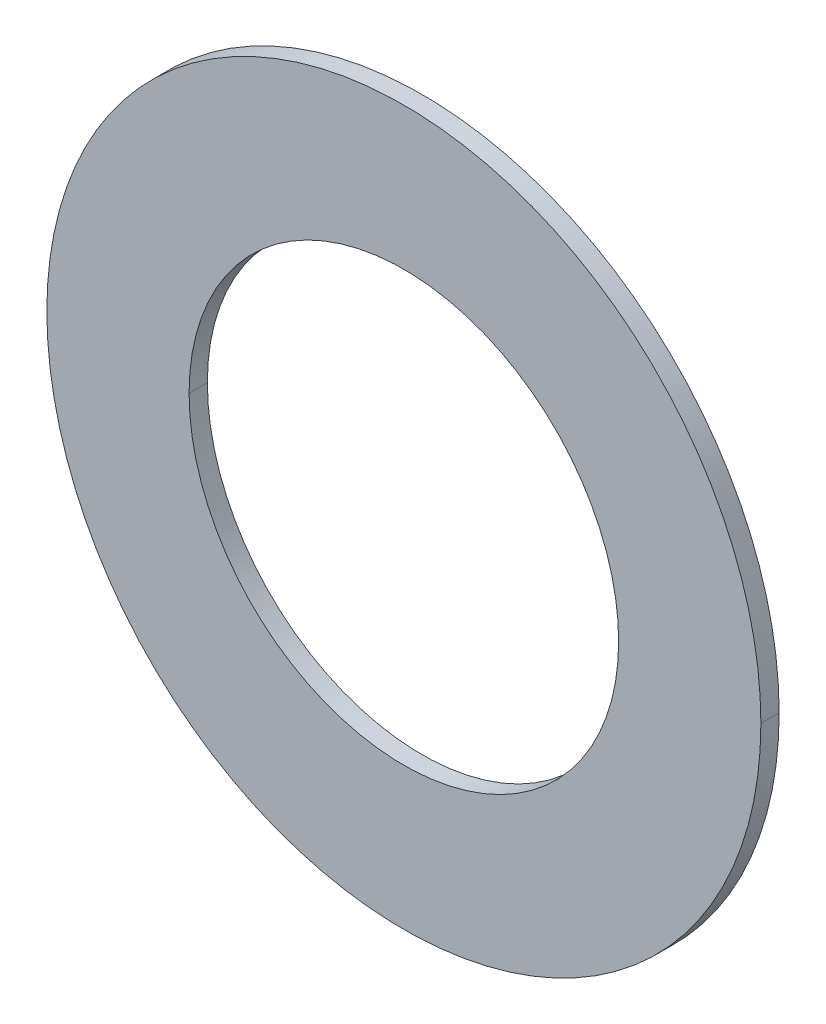
ISO-10303-21;
HEADER;
FILE_DESCRIPTION(('STEP AP214'),'2;1');
FILE_NAME('part.step','',(''),(''),'','','');
FILE_SCHEMA(('AUTOMOTIVE_DESIGN { 1 0 10303 214 1 1 1 1 }'));
ENDSEC;
DATA;
#1=APPLICATION_CONTEXT('core data for automotive mechanical design processes');
#2=APPLICATION_PROTOCOL_DEFINITION('international standard','automotive_design',2000,#1);
#3=PRODUCT_CONTEXT('',#1,'mechanical');
#4=PRODUCT('Part','Part','',(#3));
#5=PRODUCT_RELATED_PRODUCT_CATEGORY('part','',(#4));
#6=PRODUCT_DEFINITION_FORMATION('','',#4);
#7=PRODUCT_DEFINITION_CONTEXT('part definition',#1,'design');
#8=PRODUCT_DEFINITION('design','',#6,#7);
#9=PRODUCT_DEFINITION_SHAPE('','',#8);
#10=(LENGTH_UNIT() NAMED_UNIT(*) SI_UNIT(.MILLI.,.METRE.));
#11=(NAMED_UNIT(*) PLANE_ANGLE_UNIT() SI_UNIT($,.RADIAN.));
#12=(NAMED_UNIT(*) SI_UNIT($,.STERADIAN.) SOLID_ANGLE_UNIT());
#13=UNCERTAINTY_MEASURE_WITH_UNIT(LENGTH_MEASURE(1.E-05),#10,'distance_accuracy_value','');
#14=(GEOMETRIC_REPRESENTATION_CONTEXT(3) GLOBAL_UNCERTAINTY_ASSIGNED_CONTEXT((#13)) GLOBAL_UNIT_ASSIGNED_CONTEXT((#10,
#11,#12)) REPRESENTATION_CONTEXT('',''));
#15=CARTESIAN_POINT('',(0.,0.,0.));
#16=DIRECTION('',(0.,0.,1.));
#17=DIRECTION('',(1.,0.,0.));
#18=AXIS2_PLACEMENT_3D('',#15,#16,#17);
#19=CARTESIAN_POINT('',(0.,0.,0.4064));
#20=DIRECTION('',(0.,0.,1.));
#21=DIRECTION('',(1.,0.,0.));
#22=AXIS2_PLACEMENT_3D('',#19,#20,#21);
#23=PLANE('',#22);
#24=CARTESIAN_POINT('',(0.,0.,0.4064));
#25=DIRECTION('',(0.,0.,1.));
#26=DIRECTION('',(1.,0.,0.));
#27=AXIS2_PLACEMENT_3D('',#24,#25,#26);
#28=CIRCLE('',#27,9.5504);
#29=CARTESIAN_POINT('',(9.5504,0.,0.4064));
#30=VERTEX_POINT('',#29);
#31=CARTESIAN_POINT('',(-9.5504,0.,0.4064));
#32=VERTEX_POINT('',#31);
#33=EDGE_CURVE('E13',#30,#32,#28,.T.);
#34=ORIENTED_EDGE('',*,*,#33,.F.);
#35=CARTESIAN_POINT('',(0.,0.,0.4064));
#36=DIRECTION('',(0.,0.,1.));
#37=DIRECTION('',(1.,0.,0.));
#38=AXIS2_PLACEMENT_3D('',#35,#36,#37);
#39=CIRCLE('',#38,9.5504);
#40=EDGE_CURVE('E103',#32,#30,#39,.T.);
#41=ORIENTED_EDGE('',*,*,#40,.F.);
#42=EDGE_LOOP('',(#34,#41));
#43=FACE_BOUND('',#42,.T.);
#44=CARTESIAN_POINT('',(0.,0.,0.4064));
#45=DIRECTION('',(0.,0.,1.));
#46=DIRECTION('',(1.,0.,0.));
#47=AXIS2_PLACEMENT_3D('',#44,#45,#46);
#48=CIRCLE('',#47,15.875);
#49=CARTESIAN_POINT('',(15.875,0.,0.4064));
#50=VERTEX_POINT('',#49);
#51=CARTESIAN_POINT('',(-15.875,0.,0.4064));
#52=VERTEX_POINT('',#51);
#53=EDGE_CURVE('E124',#50,#52,#48,.T.);
#54=ORIENTED_EDGE('',*,*,#53,.T.);
#55=CARTESIAN_POINT('',(0.,0.,0.4064));
#56=DIRECTION('',(0.,0.,1.));
#57=DIRECTION('',(1.,0.,0.));
#58=AXIS2_PLACEMENT_3D('',#55,#56,#57);
#59=CIRCLE('',#58,15.875);
#60=EDGE_CURVE('E45',#52,#50,#59,.T.);
#61=ORIENTED_EDGE('',*,*,#60,.T.);
#62=EDGE_LOOP('',(#54,#61));
#63=FACE_BOUND('',#62,.T.);
#64=ADVANCED_FACE('F24',(#43,#63),#23,.T.);
#65=CARTESIAN_POINT('',(0.,0.,-0.4064));
#66=DIRECTION('',(0.,0.,1.));
#67=DIRECTION('',(1.,0.,0.));
#68=AXIS2_PLACEMENT_3D('',#65,#66,#67);
#69=CYLINDRICAL_SURFACE('',#68,9.5504);
#70=DIRECTION('',(0.,0.,1.));
#71=VECTOR('',#70,1.);
#72=CARTESIAN_POINT('',(-9.5504,0.,-0.4064));
#73=LINE('',#72,#71);
#74=CARTESIAN_POINT('',(-9.5504,0.,-0.4064));
#75=VERTEX_POINT('',#74);
#76=EDGE_CURVE('E96',#75,#32,#73,.T.);
#77=ORIENTED_EDGE('',*,*,#76,.F.);
#78=CARTESIAN_POINT('',(0.,0.,-0.4064));
#79=DIRECTION('',(0.,0.,1.));
#80=DIRECTION('',(1.,0.,0.));
#81=AXIS2_PLACEMENT_3D('',#78,#79,#80);
#82=CIRCLE('',#81,9.5504);
#83=CARTESIAN_POINT('',(9.5504,0.,-0.4064));
#84=VERTEX_POINT('',#83);
#85=EDGE_CURVE('E33',#84,#75,#82,.T.);
#86=ORIENTED_EDGE('',*,*,#85,.F.);
#87=DIRECTION('',(0.,0.,1.));
#88=VECTOR('',#87,1.);
#89=CARTESIAN_POINT('',(9.5504,0.,-0.4064));
#90=LINE('',#89,#88);
#91=EDGE_CURVE('E93',#84,#30,#90,.T.);
#92=ORIENTED_EDGE('',*,*,#91,.T.);
#93=ORIENTED_EDGE('',*,*,#33,.T.);
#94=EDGE_LOOP('',(#77,#86,#92,#93));
#95=FACE_BOUND('',#94,.T.);
#96=ADVANCED_FACE('F26',(#95),#69,.F.);
#97=CARTESIAN_POINT('',(0.,0.,-0.4064));
#98=DIRECTION('',(0.,0.,1.));
#99=DIRECTION('',(1.,0.,0.));
#100=AXIS2_PLACEMENT_3D('',#97,#98,#99);
#101=PLANE('',#100);
#102=ORIENTED_EDGE('',*,*,#85,.T.);
#103=CARTESIAN_POINT('',(0.,0.,-0.4064));
#104=DIRECTION('',(0.,0.,1.));
#105=DIRECTION('',(1.,0.,0.));
#106=AXIS2_PLACEMENT_3D('',#103,#104,#105);
#107=CIRCLE('',#106,9.5504);
#108=EDGE_CURVE('E102',#75,#84,#107,.T.);
#109=ORIENTED_EDGE('',*,*,#108,.T.);
#110=EDGE_LOOP('',(#102,#109));
#111=FACE_BOUND('',#110,.T.);
#112=CARTESIAN_POINT('',(0.,0.,-0.4064));
#113=DIRECTION('',(0.,0.,1.));
#114=DIRECTION('',(1.,0.,0.));
#115=AXIS2_PLACEMENT_3D('',#112,#113,#114);
#116=CIRCLE('',#115,15.875);
#117=CARTESIAN_POINT('',(15.875,0.,-0.4064));
#118=VERTEX_POINT('',#117);
#119=CARTESIAN_POINT('',(-15.875,0.,-0.4064));
#120=VERTEX_POINT('',#119);
#121=EDGE_CURVE('E105',#118,#120,#116,.T.);
#122=ORIENTED_EDGE('',*,*,#121,.F.);
#123=CARTESIAN_POINT('',(0.,0.,-0.4064));
#124=DIRECTION('',(0.,0.,1.));
#125=DIRECTION('',(1.,0.,0.));
#126=AXIS2_PLACEMENT_3D('',#123,#124,#125);
#127=CIRCLE('',#126,15.875);
#128=EDGE_CURVE('E79',#120,#118,#127,.T.);
#129=ORIENTED_EDGE('',*,*,#128,.F.);
#130=EDGE_LOOP('',(#122,#129));
#131=FACE_BOUND('',#130,.T.);
#132=ADVANCED_FACE('F107',(#111,#131),#101,.F.);
#133=CARTESIAN_POINT('',(0.,0.,-0.4064));
#134=DIRECTION('',(0.,0.,1.));
#135=DIRECTION('',(1.,0.,0.));
#136=AXIS2_PLACEMENT_3D('',#133,#134,#135);
#137=CYLINDRICAL_SURFACE('',#136,15.875);
#138=DIRECTION('',(0.,0.,1.));
#139=VECTOR('',#138,1.);
#140=CARTESIAN_POINT('',(-15.875,0.,-0.4064));
#141=LINE('',#140,#139);
#142=EDGE_CURVE('E127',#120,#52,#141,.T.);
#143=ORIENTED_EDGE('',*,*,#142,.F.);
#144=ORIENTED_EDGE('',*,*,#128,.T.);
#145=DIRECTION('',(0.,0.,1.));
#146=VECTOR('',#145,1.);
#147=CARTESIAN_POINT('',(15.875,0.,-0.4064));
#148=LINE('',#147,#146);
#149=EDGE_CURVE('E121',#118,#50,#148,.T.);
#150=ORIENTED_EDGE('',*,*,#149,.T.);
#151=ORIENTED_EDGE('',*,*,#60,.F.);
#152=EDGE_LOOP('',(#143,#144,#150,#151));
#153=FACE_BOUND('',#152,.T.);
#154=ADVANCED_FACE('F140',(#153),#137,.T.);
#155=CARTESIAN_POINT('',(0.,0.,-0.4064));
#156=DIRECTION('',(0.,0.,1.));
#157=DIRECTION('',(1.,0.,0.));
#158=AXIS2_PLACEMENT_3D('',#155,#156,#157);
#159=CYLINDRICAL_SURFACE('',#158,15.875);
#160=ORIENTED_EDGE('',*,*,#121,.T.);
#161=ORIENTED_EDGE('',*,*,#142,.T.);
#162=ORIENTED_EDGE('',*,*,#53,.F.);
#163=ORIENTED_EDGE('',*,*,#149,.F.);
#164=EDGE_LOOP('',(#160,#161,#162,#163));
#165=FACE_BOUND('',#164,.T.);
#166=ADVANCED_FACE('F138',(#165),#159,.T.);
#167=CARTESIAN_POINT('',(0.,0.,-0.4064));
#168=DIRECTION('',(0.,0.,1.));
#169=DIRECTION('',(1.,0.,0.));
#170=AXIS2_PLACEMENT_3D('',#167,#168,#169);
#171=CYLINDRICAL_SURFACE('',#170,9.5504);
#172=ORIENTED_EDGE('',*,*,#108,.F.);
#173=ORIENTED_EDGE('',*,*,#76,.T.);
#174=ORIENTED_EDGE('',*,*,#40,.T.);
#175=ORIENTED_EDGE('',*,*,#91,.F.);
#176=EDGE_LOOP('',(#172,#173,#174,#175));
#177=FACE_BOUND('',#176,.T.);
#178=ADVANCED_FACE('F101',(#177),#171,.F.);
#179=CLOSED_SHELL('',(#64,#96,#132,#154,#166,#178));
#180=MANIFOLD_SOLID_BREP('B1',#179);
#181=ADVANCED_BREP_SHAPE_REPRESENTATION('',(#18,#180),#14);
#182=SHAPE_DEFINITION_REPRESENTATION(#9,#181);
ENDSEC;
END-ISO-10303-21;
